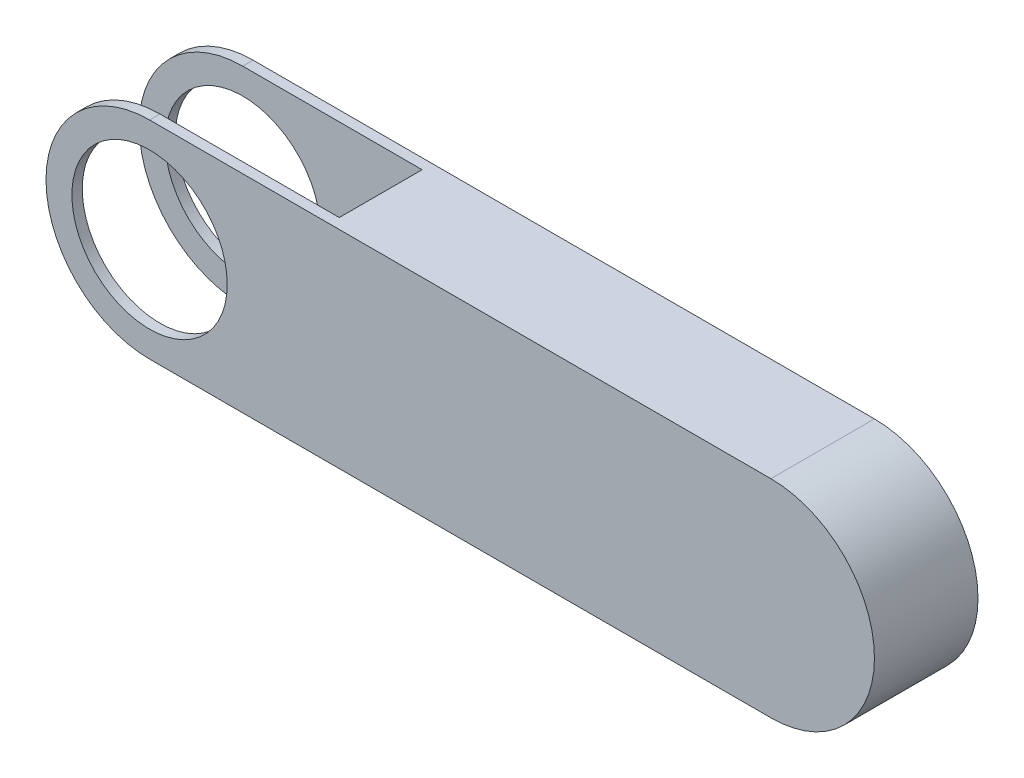
ISO-10303-21;
HEADER;
FILE_DESCRIPTION(('STEP AP214'),'2;1');
FILE_NAME('part.step','',(''),(''),'','','');
FILE_SCHEMA(('AUTOMOTIVE_DESIGN { 1 0 10303 214 1 1 1 1 }'));
ENDSEC;
DATA;
#1=APPLICATION_CONTEXT('core data for automotive mechanical design processes');
#2=APPLICATION_PROTOCOL_DEFINITION('international standard','automotive_design',2000,#1);
#3=PRODUCT_CONTEXT('',#1,'mechanical');
#4=PRODUCT('Part','Part','',(#3));
#5=PRODUCT_RELATED_PRODUCT_CATEGORY('part','',(#4));
#6=PRODUCT_DEFINITION_FORMATION('','',#4);
#7=PRODUCT_DEFINITION_CONTEXT('part definition',#1,'design');
#8=PRODUCT_DEFINITION('design','',#6,#7);
#9=PRODUCT_DEFINITION_SHAPE('','',#8);
#10=(LENGTH_UNIT() NAMED_UNIT(*) SI_UNIT(.MILLI.,.METRE.));
#11=(NAMED_UNIT(*) PLANE_ANGLE_UNIT() SI_UNIT($,.RADIAN.));
#12=(NAMED_UNIT(*) SI_UNIT($,.STERADIAN.) SOLID_ANGLE_UNIT());
#13=UNCERTAINTY_MEASURE_WITH_UNIT(LENGTH_MEASURE(1.E-05),#10,'distance_accuracy_value','');
#14=(GEOMETRIC_REPRESENTATION_CONTEXT(3) GLOBAL_UNCERTAINTY_ASSIGNED_CONTEXT((#13)) GLOBAL_UNIT_ASSIGNED_CONTEXT((#10,
#11,#12)) REPRESENTATION_CONTEXT('',''));
#15=CARTESIAN_POINT('',(0.,0.,0.));
#16=DIRECTION('',(0.,0.,1.));
#17=DIRECTION('',(1.,0.,0.));
#18=AXIS2_PLACEMENT_3D('',#15,#16,#17);
#19=CARTESIAN_POINT('',(0.,0.,-50.));
#20=DIRECTION('',(0.,0.,1.));
#21=DIRECTION('',(1.,0.,0.));
#22=AXIS2_PLACEMENT_3D('',#19,#20,#21);
#23=CYLINDRICAL_SURFACE('',#22,100.);
#24=DIRECTION('',(0.,0.,1.));
#25=VECTOR('',#24,1.);
#26=CARTESIAN_POINT('',(0.,-100.,-50.));
#27=LINE('',#26,#25);
#28=CARTESIAN_POINT('',(0.,-100.,-50.));
#29=VERTEX_POINT('',#28);
#30=CARTESIAN_POINT('',(0.,-100.,-40.));
#31=VERTEX_POINT('',#30);
#32=EDGE_CURVE('E193',#29,#31,#27,.T.);
#33=ORIENTED_EDGE('',*,*,#32,.T.);
#34=CARTESIAN_POINT('',(0.,0.,-40.));
#35=DIRECTION('',(0.,0.,1.));
#36=DIRECTION('',(1.,0.,0.));
#37=AXIS2_PLACEMENT_3D('',#34,#35,#36);
#38=CIRCLE('',#37,100.);
#39=CARTESIAN_POINT('',(0.,100.,-40.));
#40=VERTEX_POINT('',#39);
#41=EDGE_CURVE('E59',#31,#40,#38,.F.);
#42=ORIENTED_EDGE('',*,*,#41,.T.);
#43=DIRECTION('',(0.,0.,1.));
#44=VECTOR('',#43,1.);
#45=CARTESIAN_POINT('',(0.,100.,-50.));
#46=LINE('',#45,#44);
#47=CARTESIAN_POINT('',(0.,100.,-50.));
#48=VERTEX_POINT('',#47);
#49=EDGE_CURVE('E52',#48,#40,#46,.T.);
#50=ORIENTED_EDGE('',*,*,#49,.F.);
#51=CARTESIAN_POINT('',(0.,0.,-50.));
#52=DIRECTION('',(0.,0.,1.));
#53=DIRECTION('',(1.,0.,0.));
#54=AXIS2_PLACEMENT_3D('',#51,#52,#53);
#55=CIRCLE('',#54,100.);
#56=EDGE_CURVE('E169',#48,#29,#55,.T.);
#57=ORIENTED_EDGE('',*,*,#56,.T.);
#58=EDGE_LOOP('',(#33,#42,#50,#57));
#59=FACE_BOUND('',#58,.T.);
#60=ADVANCED_FACE('F43',(#59),#23,.T.);
#61=CARTESIAN_POINT('',(0.,0.,50.));
#62=DIRECTION('',(0.,0.,-1.));
#63=DIRECTION('',(-1.,0.,0.));
#64=AXIS2_PLACEMENT_3D('',#61,#62,#63);
#65=CYLINDRICAL_SURFACE('',#64,75.);
#66=CARTESIAN_POINT('',(0.,0.,-50.));
#67=DIRECTION('',(0.,0.,1.));
#68=DIRECTION('',(1.,0.,0.));
#69=AXIS2_PLACEMENT_3D('',#66,#67,#68);
#70=CIRCLE('',#69,75.);
#71=CARTESIAN_POINT('',(75.,0.,-50.));
#72=VERTEX_POINT('',#71);
#73=EDGE_CURVE('E120',#72,#72,#70,.T.);
#74=ORIENTED_EDGE('',*,*,#73,.F.);
#75=EDGE_LOOP('',(#74));
#76=FACE_BOUND('',#75,.T.);
#77=CARTESIAN_POINT('',(0.,0.,-40.));
#78=DIRECTION('',(0.,0.,1.));
#79=DIRECTION('',(1.,0.,0.));
#80=AXIS2_PLACEMENT_3D('',#77,#78,#79);
#81=CIRCLE('',#80,75.);
#82=CARTESIAN_POINT('',(75.,0.,-40.));
#83=VERTEX_POINT('',#82);
#84=EDGE_CURVE('E197',#83,#83,#81,.T.);
#85=ORIENTED_EDGE('',*,*,#84,.T.);
#86=EDGE_LOOP('',(#85));
#87=FACE_BOUND('',#86,.T.);
#88=ADVANCED_FACE('F242',(#76,#87),#65,.F.);
#89=CARTESIAN_POINT('',(0.,0.,40.));
#90=DIRECTION('',(0.,0.,1.));
#91=DIRECTION('',(1.,0.,0.));
#92=AXIS2_PLACEMENT_3D('',#89,#90,#91);
#93=CIRCLE('',#92,100.);
#94=CARTESIAN_POINT('',(0.,-100.,40.));
#95=VERTEX_POINT('',#94);
#96=CARTESIAN_POINT('',(0.,100.,40.));
#97=VERTEX_POINT('',#96);
#98=EDGE_CURVE('E141',#95,#97,#93,.F.);
#99=ORIENTED_EDGE('',*,*,#98,.F.);
#100=CARTESIAN_POINT('',(0.,-100.,50.));
#101=VERTEX_POINT('',#100);
#102=EDGE_CURVE('E183',#95,#101,#27,.T.);
#103=ORIENTED_EDGE('',*,*,#102,.T.);
#104=CARTESIAN_POINT('',(0.,0.,50.));
#105=DIRECTION('',(0.,0.,1.));
#106=DIRECTION('',(1.,0.,0.));
#107=AXIS2_PLACEMENT_3D('',#104,#105,#106);
#108=CIRCLE('',#107,100.);
#109=CARTESIAN_POINT('',(0.,100.,50.));
#110=VERTEX_POINT('',#109);
#111=EDGE_CURVE('E153',#110,#101,#108,.T.);
#112=ORIENTED_EDGE('',*,*,#111,.F.);
#113=EDGE_CURVE('E186',#97,#110,#46,.T.);
#114=ORIENTED_EDGE('',*,*,#113,.F.);
#115=EDGE_LOOP('',(#99,#103,#112,#114));
#116=FACE_BOUND('',#115,.T.);
#117=ADVANCED_FACE('F45',(#116),#23,.T.);
#118=CARTESIAN_POINT('',(0.,100.,-50.));
#119=DIRECTION('',(0.,-1.,0.));
#120=DIRECTION('',(0.,0.,-1.));
#121=AXIS2_PLACEMENT_3D('',#118,#119,#120);
#122=PLANE('',#121);
#123=DIRECTION('',(0.,0.,-1.));
#124=VECTOR('',#123,1.);
#125=CARTESIAN_POINT('',(173.205080756888,100.,40.));
#126=LINE('',#125,#124);
#127=CARTESIAN_POINT('',(173.205080756888,100.,40.));
#128=VERTEX_POINT('',#127);
#129=CARTESIAN_POINT('',(173.205080756888,100.,-40.));
#130=VERTEX_POINT('',#129);
#131=EDGE_CURVE('E110',#128,#130,#126,.T.);
#132=ORIENTED_EDGE('',*,*,#131,.F.);
#133=DIRECTION('',(-1.,0.,0.));
#134=VECTOR('',#133,1.);
#135=CARTESIAN_POINT('',(0.,100.,40.));
#136=LINE('',#135,#134);
#137=EDGE_CURVE('E121',#128,#97,#136,.T.);
#138=ORIENTED_EDGE('',*,*,#137,.T.);
#139=ORIENTED_EDGE('',*,*,#113,.T.);
#140=DIRECTION('',(1.,0.,0.));
#141=VECTOR('',#140,1.);
#142=CARTESIAN_POINT('',(0.,100.,50.));
#143=LINE('',#142,#141);
#144=CARTESIAN_POINT('',(600.,100.,50.));
#145=VERTEX_POINT('',#144);
#146=EDGE_CURVE('E165',#110,#145,#143,.T.);
#147=ORIENTED_EDGE('',*,*,#146,.T.);
#148=DIRECTION('',(0.,0.,1.));
#149=VECTOR('',#148,1.);
#150=CARTESIAN_POINT('',(600.,100.,-50.));
#151=LINE('',#150,#149);
#152=CARTESIAN_POINT('',(600.,100.,-50.));
#153=VERTEX_POINT('',#152);
#154=EDGE_CURVE('E187',#153,#145,#151,.T.);
#155=ORIENTED_EDGE('',*,*,#154,.F.);
#156=DIRECTION('',(1.,0.,0.));
#157=VECTOR('',#156,1.);
#158=CARTESIAN_POINT('',(0.,100.,-50.));
#159=LINE('',#158,#157);
#160=EDGE_CURVE('E180',#48,#153,#159,.T.);
#161=ORIENTED_EDGE('',*,*,#160,.F.);
#162=ORIENTED_EDGE('',*,*,#49,.T.);
#163=DIRECTION('',(-1.,0.,0.));
#164=VECTOR('',#163,1.);
#165=CARTESIAN_POINT('',(0.,100.,-40.));
#166=LINE('',#165,#164);
#167=EDGE_CURVE('E124',#130,#40,#166,.T.);
#168=ORIENTED_EDGE('',*,*,#167,.F.);
#169=EDGE_LOOP('',(#132,#138,#139,#147,#155,#161,#162,#168));
#170=FACE_BOUND('',#169,.T.);
#171=ADVANCED_FACE('F128',(#170),#122,.F.);
#172=CARTESIAN_POINT('',(600.,0.,-50.));
#173=DIRECTION('',(0.,0.,1.));
#174=DIRECTION('',(1.,0.,0.));
#175=AXIS2_PLACEMENT_3D('',#172,#173,#174);
#176=CYLINDRICAL_SURFACE('',#175,100.);
#177=ORIENTED_EDGE('',*,*,#154,.T.);
#178=CARTESIAN_POINT('',(600.,0.,50.));
#179=DIRECTION('',(0.,0.,1.));
#180=DIRECTION('',(1.,0.,0.));
#181=AXIS2_PLACEMENT_3D('',#178,#179,#180);
#182=CIRCLE('',#181,100.);
#183=CARTESIAN_POINT('',(600.,-100.,50.));
#184=VERTEX_POINT('',#183);
#185=EDGE_CURVE('E161',#184,#145,#182,.T.);
#186=ORIENTED_EDGE('',*,*,#185,.F.);
#187=DIRECTION('',(0.,0.,1.));
#188=VECTOR('',#187,1.);
#189=CARTESIAN_POINT('',(600.,-100.,-50.));
#190=LINE('',#189,#188);
#191=CARTESIAN_POINT('',(600.,-100.,-50.));
#192=VERTEX_POINT('',#191);
#193=EDGE_CURVE('E190',#192,#184,#190,.T.);
#194=ORIENTED_EDGE('',*,*,#193,.F.);
#195=CARTESIAN_POINT('',(600.,0.,-50.));
#196=DIRECTION('',(0.,0.,1.));
#197=DIRECTION('',(1.,0.,0.));
#198=AXIS2_PLACEMENT_3D('',#195,#196,#197);
#199=CIRCLE('',#198,100.);
#200=EDGE_CURVE('E176',#192,#153,#199,.T.);
#201=ORIENTED_EDGE('',*,*,#200,.T.);
#202=EDGE_LOOP('',(#177,#186,#194,#201));
#203=FACE_BOUND('',#202,.T.);
#204=ADVANCED_FACE('F222',(#203),#176,.T.);
#205=CARTESIAN_POINT('',(0.,-100.,-50.));
#206=DIRECTION('',(0.,-1.,0.));
#207=DIRECTION('',(0.,0.,-1.));
#208=AXIS2_PLACEMENT_3D('',#205,#206,#207);
#209=PLANE('',#208);
#210=DIRECTION('',(-1.,0.,0.));
#211=VECTOR('',#210,1.);
#212=CARTESIAN_POINT('',(0.,-100.,40.));
#213=LINE('',#212,#211);
#214=CARTESIAN_POINT('',(173.205080756888,-100.,40.));
#215=VERTEX_POINT('',#214);
#216=EDGE_CURVE('E135',#215,#95,#213,.T.);
#217=ORIENTED_EDGE('',*,*,#216,.F.);
#218=DIRECTION('',(0.,0.,-1.));
#219=VECTOR('',#218,1.);
#220=CARTESIAN_POINT('',(173.205080756888,-100.,40.));
#221=LINE('',#220,#219);
#222=CARTESIAN_POINT('',(173.205080756888,-100.,-40.));
#223=VERTEX_POINT('',#222);
#224=EDGE_CURVE('E11',#215,#223,#221,.T.);
#225=ORIENTED_EDGE('',*,*,#224,.T.);
#226=DIRECTION('',(-1.,0.,0.));
#227=VECTOR('',#226,1.);
#228=CARTESIAN_POINT('',(0.,-100.,-40.));
#229=LINE('',#228,#227);
#230=EDGE_CURVE('E125',#223,#31,#229,.T.);
#231=ORIENTED_EDGE('',*,*,#230,.T.);
#232=ORIENTED_EDGE('',*,*,#32,.F.);
#233=DIRECTION('',(1.,0.,0.));
#234=VECTOR('',#233,1.);
#235=CARTESIAN_POINT('',(0.,-100.,-50.));
#236=LINE('',#235,#234);
#237=EDGE_CURVE('E172',#29,#192,#236,.T.);
#238=ORIENTED_EDGE('',*,*,#237,.T.);
#239=ORIENTED_EDGE('',*,*,#193,.T.);
#240=DIRECTION('',(1.,0.,0.));
#241=VECTOR('',#240,1.);
#242=CARTESIAN_POINT('',(0.,-100.,50.));
#243=LINE('',#242,#241);
#244=EDGE_CURVE('E157',#101,#184,#243,.T.);
#245=ORIENTED_EDGE('',*,*,#244,.F.);
#246=ORIENTED_EDGE('',*,*,#102,.F.);
#247=EDGE_LOOP('',(#217,#225,#231,#232,#238,#239,#245,#246));
#248=FACE_BOUND('',#247,.T.);
#249=ADVANCED_FACE('F207',(#248),#209,.T.);
#250=CARTESIAN_POINT('',(0.,0.,-50.));
#251=DIRECTION('',(0.,0.,1.));
#252=DIRECTION('',(1.,0.,0.));
#253=AXIS2_PLACEMENT_3D('',#250,#251,#252);
#254=PLANE('',#253);
#255=ORIENTED_EDGE('',*,*,#73,.T.);
#256=EDGE_LOOP('',(#255));
#257=FACE_BOUND('',#256,.T.);
#258=ORIENTED_EDGE('',*,*,#56,.F.);
#259=ORIENTED_EDGE('',*,*,#160,.T.);
#260=ORIENTED_EDGE('',*,*,#200,.F.);
#261=ORIENTED_EDGE('',*,*,#237,.F.);
#262=EDGE_LOOP('',(#258,#259,#260,#261));
#263=FACE_BOUND('',#262,.T.);
#264=ADVANCED_FACE('F211',(#257,#263),#254,.F.);
#265=CARTESIAN_POINT('',(0.,0.,50.));
#266=DIRECTION('',(0.,0.,1.));
#267=DIRECTION('',(1.,0.,0.));
#268=AXIS2_PLACEMENT_3D('',#265,#266,#267);
#269=PLANE('',#268);
#270=CARTESIAN_POINT('',(0.,0.,50.));
#271=DIRECTION('',(0.,0.,1.));
#272=DIRECTION('',(1.,0.,0.));
#273=AXIS2_PLACEMENT_3D('',#270,#271,#272);
#274=CIRCLE('',#273,75.);
#275=CARTESIAN_POINT('',(75.,0.,50.));
#276=VERTEX_POINT('',#275);
#277=EDGE_CURVE('E149',#276,#276,#274,.T.);
#278=ORIENTED_EDGE('',*,*,#277,.F.);
#279=EDGE_LOOP('',(#278));
#280=FACE_BOUND('',#279,.T.);
#281=ORIENTED_EDGE('',*,*,#111,.T.);
#282=ORIENTED_EDGE('',*,*,#244,.T.);
#283=ORIENTED_EDGE('',*,*,#185,.T.);
#284=ORIENTED_EDGE('',*,*,#146,.F.);
#285=EDGE_LOOP('',(#281,#282,#283,#284));
#286=FACE_BOUND('',#285,.T.);
#287=ADVANCED_FACE('F219',(#280,#286),#269,.T.);
#288=CARTESIAN_POINT('',(0.,0.,40.));
#289=DIRECTION('',(0.,0.,1.));
#290=DIRECTION('',(1.,0.,0.));
#291=AXIS2_PLACEMENT_3D('',#288,#289,#290);
#292=CIRCLE('',#291,75.);
#293=CARTESIAN_POINT('',(75.,0.,40.));
#294=VERTEX_POINT('',#293);
#295=EDGE_CURVE('E130',#294,#294,#292,.T.);
#296=ORIENTED_EDGE('',*,*,#295,.F.);
#297=EDGE_LOOP('',(#296));
#298=FACE_BOUND('',#297,.T.);
#299=ORIENTED_EDGE('',*,*,#277,.T.);
#300=EDGE_LOOP('',(#299));
#301=FACE_BOUND('',#300,.T.);
#302=ADVANCED_FACE('F239',(#298,#301),#65,.F.);
#303=CARTESIAN_POINT('',(0.,0.,40.));
#304=DIRECTION('',(0.,0.,-1.));
#305=DIRECTION('',(-1.,0.,0.));
#306=AXIS2_PLACEMENT_3D('',#303,#304,#305);
#307=CYLINDRICAL_SURFACE('',#306,200.);
#308=ORIENTED_EDGE('',*,*,#131,.T.);
#309=CARTESIAN_POINT('',(0.,0.,-40.));
#310=DIRECTION('',(0.,0.,1.));
#311=DIRECTION('',(1.,0.,0.));
#312=AXIS2_PLACEMENT_3D('',#309,#310,#311);
#313=CIRCLE('',#312,200.);
#314=EDGE_CURVE('E113',#223,#130,#313,.T.);
#315=ORIENTED_EDGE('',*,*,#314,.F.);
#316=ORIENTED_EDGE('',*,*,#224,.F.);
#317=CARTESIAN_POINT('',(0.,0.,40.));
#318=DIRECTION('',(0.,0.,1.));
#319=DIRECTION('',(1.,0.,0.));
#320=AXIS2_PLACEMENT_3D('',#317,#318,#319);
#321=CIRCLE('',#320,200.);
#322=EDGE_CURVE('E115',#215,#128,#321,.T.);
#323=ORIENTED_EDGE('',*,*,#322,.T.);
#324=EDGE_LOOP('',(#308,#315,#316,#323));
#325=FACE_BOUND('',#324,.T.);
#326=ADVANCED_FACE('F112',(#325),#307,.F.);
#327=CARTESIAN_POINT('',(0.,0.,40.));
#328=DIRECTION('',(0.,0.,1.));
#329=DIRECTION('',(1.,0.,0.));
#330=AXIS2_PLACEMENT_3D('',#327,#328,#329);
#331=PLANE('',#330);
#332=ORIENTED_EDGE('',*,*,#295,.T.);
#333=EDGE_LOOP('',(#332));
#334=FACE_BOUND('',#333,.T.);
#335=ORIENTED_EDGE('',*,*,#322,.F.);
#336=ORIENTED_EDGE('',*,*,#216,.T.);
#337=ORIENTED_EDGE('',*,*,#98,.T.);
#338=ORIENTED_EDGE('',*,*,#137,.F.);
#339=EDGE_LOOP('',(#335,#336,#337,#338));
#340=FACE_BOUND('',#339,.T.);
#341=ADVANCED_FACE('F229',(#334,#340),#331,.F.);
#342=CARTESIAN_POINT('',(0.,0.,-40.));
#343=DIRECTION('',(0.,0.,1.));
#344=DIRECTION('',(1.,0.,0.));
#345=AXIS2_PLACEMENT_3D('',#342,#343,#344);
#346=PLANE('',#345);
#347=ORIENTED_EDGE('',*,*,#84,.F.);
#348=EDGE_LOOP('',(#347));
#349=FACE_BOUND('',#348,.T.);
#350=ORIENTED_EDGE('',*,*,#167,.T.);
#351=ORIENTED_EDGE('',*,*,#41,.F.);
#352=ORIENTED_EDGE('',*,*,#230,.F.);
#353=ORIENTED_EDGE('',*,*,#314,.T.);
#354=EDGE_LOOP('',(#350,#351,#352,#353));
#355=FACE_BOUND('',#354,.T.);
#356=ADVANCED_FACE('F123',(#349,#355),#346,.T.);
#357=CLOSED_SHELL('',(#60,#88,#117,#171,#204,#249,#264,#287,#302,#326,#341,#356));
#358=MANIFOLD_SOLID_BREP('B2',#357);
#359=ADVANCED_BREP_SHAPE_REPRESENTATION('',(#18,#358),#14);
#360=SHAPE_DEFINITION_REPRESENTATION(#9,#359);
ENDSEC;
END-ISO-10303-21;
